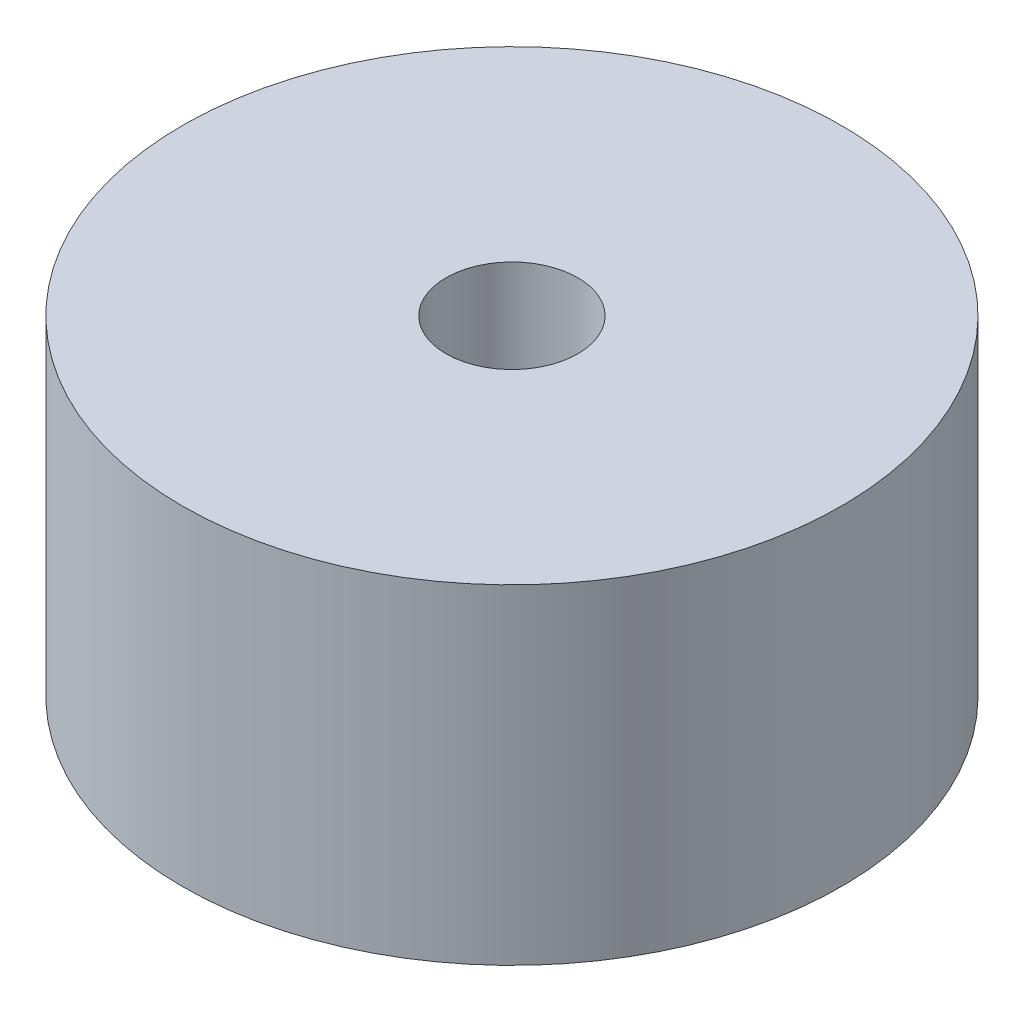
ISO-10303-21;
HEADER;
FILE_DESCRIPTION(('STEP AP214'),'2;1');
FILE_NAME('part.step','',(''),(''),'','','');
FILE_SCHEMA(('AUTOMOTIVE_DESIGN { 1 0 10303 214 1 1 1 1 }'));
ENDSEC;
DATA;
#1=APPLICATION_CONTEXT('core data for automotive mechanical design processes');
#2=APPLICATION_PROTOCOL_DEFINITION('international standard','automotive_design',2000,#1);
#3=PRODUCT_CONTEXT('',#1,'mechanical');
#4=PRODUCT('Part','Part','',(#3));
#5=PRODUCT_RELATED_PRODUCT_CATEGORY('part','',(#4));
#6=PRODUCT_DEFINITION_FORMATION('','',#4);
#7=PRODUCT_DEFINITION_CONTEXT('part definition',#1,'design');
#8=PRODUCT_DEFINITION('design','',#6,#7);
#9=PRODUCT_DEFINITION_SHAPE('','',#8);
#10=(LENGTH_UNIT() NAMED_UNIT(*) SI_UNIT(.MILLI.,.METRE.));
#11=(NAMED_UNIT(*) PLANE_ANGLE_UNIT() SI_UNIT($,.RADIAN.));
#12=(NAMED_UNIT(*) SI_UNIT($,.STERADIAN.) SOLID_ANGLE_UNIT());
#13=UNCERTAINTY_MEASURE_WITH_UNIT(LENGTH_MEASURE(1.E-05),#10,'distance_accuracy_value','');
#14=(GEOMETRIC_REPRESENTATION_CONTEXT(3) GLOBAL_UNCERTAINTY_ASSIGNED_CONTEXT((#13)) GLOBAL_UNIT_ASSIGNED_CONTEXT((#10,
#11,#12)) REPRESENTATION_CONTEXT('',''));
#15=CARTESIAN_POINT('',(0.,0.,0.));
#16=DIRECTION('',(0.,0.,1.));
#17=DIRECTION('',(1.,0.,0.));
#18=AXIS2_PLACEMENT_3D('',#15,#16,#17);
#19=CARTESIAN_POINT('',(0.,2.5,0.));
#20=DIRECTION('',(0.,1.,0.));
#21=DIRECTION('',(0.,0.,1.));
#22=AXIS2_PLACEMENT_3D('',#19,#20,#21);
#23=PLANE('',#22);
#24=CARTESIAN_POINT('',(0.,2.5,0.));
#25=DIRECTION('',(0.,1.,0.));
#26=DIRECTION('',(0.,0.,1.));
#27=AXIS2_PLACEMENT_3D('',#24,#25,#26);
#28=CIRCLE('',#27,2.5);
#29=CARTESIAN_POINT('',(0.,2.5,2.5));
#30=VERTEX_POINT('',#29);
#31=EDGE_CURVE('E10',#30,#30,#28,.T.);
#32=ORIENTED_EDGE('',*,*,#31,.T.);
#33=EDGE_LOOP('',(#32));
#34=FACE_BOUND('',#33,.T.);
#35=CARTESIAN_POINT('',(0.,2.5,0.));
#36=DIRECTION('',(0.,1.,0.));
#37=DIRECTION('',(0.,0.,1.));
#38=AXIS2_PLACEMENT_3D('',#35,#36,#37);
#39=CIRCLE('',#38,0.5);
#40=CARTESIAN_POINT('',(0.,2.5,0.5));
#41=VERTEX_POINT('',#40);
#42=EDGE_CURVE('E56',#41,#41,#39,.T.);
#43=ORIENTED_EDGE('',*,*,#42,.F.);
#44=EDGE_LOOP('',(#43));
#45=FACE_BOUND('',#44,.T.);
#46=ADVANCED_FACE('F43',(#34,#45),#23,.T.);
#47=CARTESIAN_POINT('',(0.,0.,0.));
#48=DIRECTION('',(0.,1.,0.));
#49=DIRECTION('',(0.,0.,1.));
#50=AXIS2_PLACEMENT_3D('',#47,#48,#49);
#51=PLANE('',#50);
#52=CARTESIAN_POINT('',(0.,0.,0.));
#53=DIRECTION('',(0.,1.,0.));
#54=DIRECTION('',(0.,0.,1.));
#55=AXIS2_PLACEMENT_3D('',#52,#53,#54);
#56=CIRCLE('',#55,2.5);
#57=CARTESIAN_POINT('',(0.,0.,2.5));
#58=VERTEX_POINT('',#57);
#59=EDGE_CURVE('E47',#58,#58,#56,.T.);
#60=ORIENTED_EDGE('',*,*,#59,.F.);
#61=EDGE_LOOP('',(#60));
#62=FACE_BOUND('',#61,.T.);
#63=CARTESIAN_POINT('',(0.,0.,0.));
#64=DIRECTION('',(0.,1.,0.));
#65=DIRECTION('',(0.,0.,1.));
#66=AXIS2_PLACEMENT_3D('',#63,#64,#65);
#67=CIRCLE('',#66,0.5);
#68=CARTESIAN_POINT('',(0.,0.,0.5));
#69=VERTEX_POINT('',#68);
#70=EDGE_CURVE('E58',#69,#69,#67,.T.);
#71=ORIENTED_EDGE('',*,*,#70,.T.);
#72=EDGE_LOOP('',(#71));
#73=FACE_BOUND('',#72,.T.);
#74=ADVANCED_FACE('F70',(#62,#73),#51,.F.);
#75=CARTESIAN_POINT('',(0.,2.5,0.));
#76=DIRECTION('',(0.,-1.,0.));
#77=DIRECTION('',(0.,0.,-1.));
#78=AXIS2_PLACEMENT_3D('',#75,#76,#77);
#79=CYLINDRICAL_SURFACE('',#78,2.5);
#80=ORIENTED_EDGE('',*,*,#31,.F.);
#81=EDGE_LOOP('',(#80));
#82=FACE_BOUND('',#81,.T.);
#83=ORIENTED_EDGE('',*,*,#59,.T.);
#84=EDGE_LOOP('',(#83));
#85=FACE_BOUND('',#84,.T.);
#86=ADVANCED_FACE('F45',(#82,#85),#79,.T.);
#87=CARTESIAN_POINT('',(0.,2.5,0.));
#88=DIRECTION('',(0.,-1.,0.));
#89=DIRECTION('',(0.,0.,-1.));
#90=AXIS2_PLACEMENT_3D('',#87,#88,#89);
#91=CYLINDRICAL_SURFACE('',#90,0.5);
#92=ORIENTED_EDGE('',*,*,#42,.T.);
#93=EDGE_LOOP('',(#92));
#94=FACE_BOUND('',#93,.T.);
#95=ORIENTED_EDGE('',*,*,#70,.F.);
#96=EDGE_LOOP('',(#95));
#97=FACE_BOUND('',#96,.T.);
#98=ADVANCED_FACE('F66',(#94,#97),#91,.F.);
#99=CLOSED_SHELL('',(#46,#74,#86,#98));
#100=MANIFOLD_SOLID_BREP('B2',#99);
#101=ADVANCED_BREP_SHAPE_REPRESENTATION('',(#18,#100),#14);
#102=SHAPE_DEFINITION_REPRESENTATION(#9,#101);
ENDSEC;
END-ISO-10303-21;
